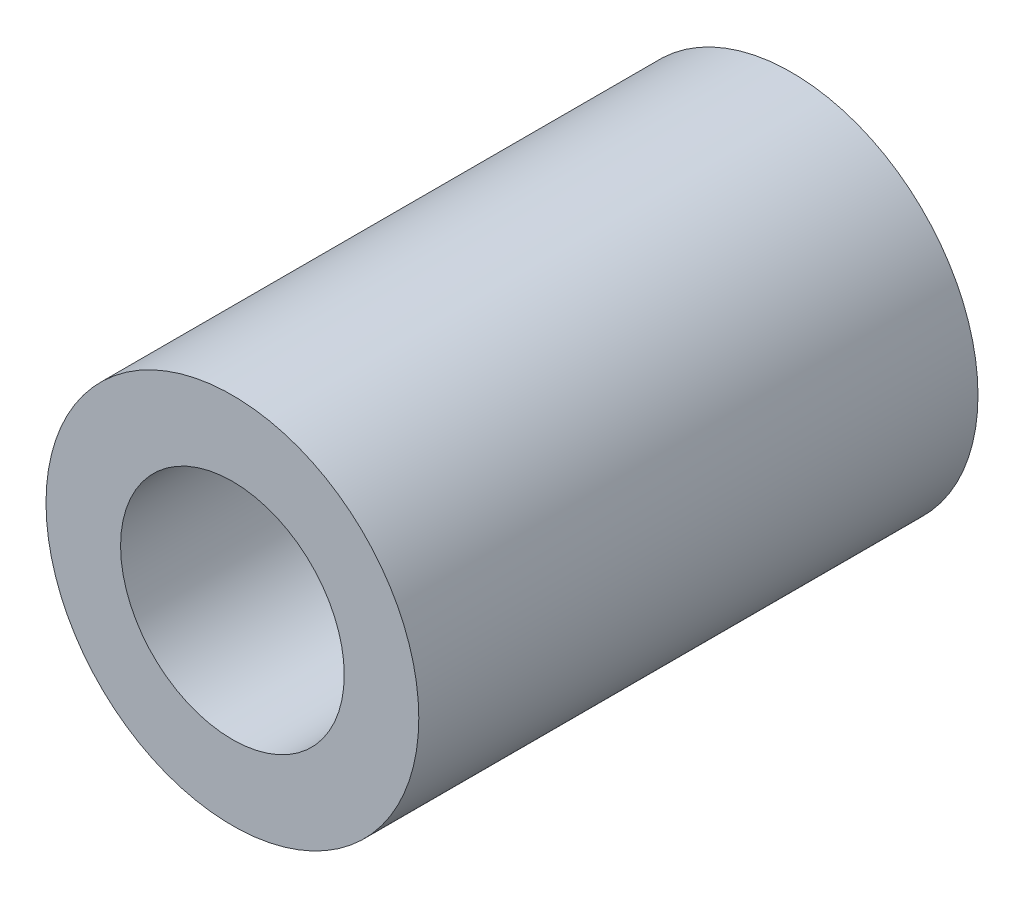
ISO-10303-21;
HEADER;
FILE_DESCRIPTION(('STEP AP214'),'2;1');
FILE_NAME('part.step','',(''),(''),'','','');
FILE_SCHEMA(('AUTOMOTIVE_DESIGN { 1 0 10303 214 1 1 1 1 }'));
ENDSEC;
DATA;
#1=APPLICATION_CONTEXT('core data for automotive mechanical design processes');
#2=APPLICATION_PROTOCOL_DEFINITION('international standard','automotive_design',2000,#1);
#3=PRODUCT_CONTEXT('',#1,'mechanical');
#4=PRODUCT('Part','Part','',(#3));
#5=PRODUCT_RELATED_PRODUCT_CATEGORY('part','',(#4));
#6=PRODUCT_DEFINITION_FORMATION('','',#4);
#7=PRODUCT_DEFINITION_CONTEXT('part definition',#1,'design');
#8=PRODUCT_DEFINITION('design','',#6,#7);
#9=PRODUCT_DEFINITION_SHAPE('','',#8);
#10=(LENGTH_UNIT() NAMED_UNIT(*) SI_UNIT(.MILLI.,.METRE.));
#11=(NAMED_UNIT(*) PLANE_ANGLE_UNIT() SI_UNIT($,.RADIAN.));
#12=(NAMED_UNIT(*) SI_UNIT($,.STERADIAN.) SOLID_ANGLE_UNIT());
#13=UNCERTAINTY_MEASURE_WITH_UNIT(LENGTH_MEASURE(1.E-05),#10,'distance_accuracy_value','');
#14=(GEOMETRIC_REPRESENTATION_CONTEXT(3) GLOBAL_UNCERTAINTY_ASSIGNED_CONTEXT((#13)) GLOBAL_UNIT_ASSIGNED_CONTEXT((#10,
#11,#12)) REPRESENTATION_CONTEXT('',''));
#15=CARTESIAN_POINT('',(0.,0.,0.));
#16=DIRECTION('',(0.,0.,1.));
#17=DIRECTION('',(1.,0.,0.));
#18=AXIS2_PLACEMENT_3D('',#15,#16,#17);
#19=CARTESIAN_POINT('',(0.,0.,15.));
#20=DIRECTION('',(0.,0.,1.));
#21=DIRECTION('',(1.,0.,0.));
#22=AXIS2_PLACEMENT_3D('',#19,#20,#21);
#23=PLANE('',#22);
#24=CARTESIAN_POINT('',(0.,0.,15.));
#25=DIRECTION('',(0.,0.,1.));
#26=DIRECTION('',(1.,0.,0.));
#27=AXIS2_PLACEMENT_3D('',#24,#25,#26);
#28=CIRCLE('',#27,10.);
#29=CARTESIAN_POINT('',(10.,0.,15.));
#30=VERTEX_POINT('',#29);
#31=EDGE_CURVE('E10',#30,#30,#28,.T.);
#32=ORIENTED_EDGE('',*,*,#31,.T.);
#33=EDGE_LOOP('',(#32));
#34=FACE_BOUND('',#33,.T.);
#35=CARTESIAN_POINT('',(0.,0.,15.));
#36=DIRECTION('',(0.,0.,1.));
#37=DIRECTION('',(1.,0.,0.));
#38=AXIS2_PLACEMENT_3D('',#35,#36,#37);
#39=CIRCLE('',#38,6.);
#40=CARTESIAN_POINT('',(6.,0.,15.));
#41=VERTEX_POINT('',#40);
#42=EDGE_CURVE('E48',#41,#41,#39,.T.);
#43=ORIENTED_EDGE('',*,*,#42,.F.);
#44=EDGE_LOOP('',(#43));
#45=FACE_BOUND('',#44,.T.);
#46=ADVANCED_FACE('F37',(#34,#45),#23,.T.);
#47=CARTESIAN_POINT('',(0.,0.,-15.));
#48=DIRECTION('',(0.,0.,1.));
#49=DIRECTION('',(1.,0.,0.));
#50=AXIS2_PLACEMENT_3D('',#47,#48,#49);
#51=PLANE('',#50);
#52=CARTESIAN_POINT('',(0.,0.,-15.));
#53=DIRECTION('',(0.,0.,1.));
#54=DIRECTION('',(1.,0.,0.));
#55=AXIS2_PLACEMENT_3D('',#52,#53,#54);
#56=CIRCLE('',#55,10.);
#57=CARTESIAN_POINT('',(10.,0.,-15.));
#58=VERTEX_POINT('',#57);
#59=EDGE_CURVE('E41',#58,#58,#56,.T.);
#60=ORIENTED_EDGE('',*,*,#59,.F.);
#61=EDGE_LOOP('',(#60));
#62=FACE_BOUND('',#61,.T.);
#63=CARTESIAN_POINT('',(0.,0.,-15.));
#64=DIRECTION('',(0.,0.,1.));
#65=DIRECTION('',(1.,0.,0.));
#66=AXIS2_PLACEMENT_3D('',#63,#64,#65);
#67=CIRCLE('',#66,6.);
#68=CARTESIAN_POINT('',(6.,0.,-15.));
#69=VERTEX_POINT('',#68);
#70=EDGE_CURVE('E50',#69,#69,#67,.T.);
#71=ORIENTED_EDGE('',*,*,#70,.T.);
#72=EDGE_LOOP('',(#71));
#73=FACE_BOUND('',#72,.T.);
#74=ADVANCED_FACE('F60',(#62,#73),#51,.F.);
#75=CARTESIAN_POINT('',(0.,0.,15.));
#76=DIRECTION('',(0.,0.,-1.));
#77=DIRECTION('',(-1.,0.,0.));
#78=AXIS2_PLACEMENT_3D('',#75,#76,#77);
#79=CYLINDRICAL_SURFACE('',#78,10.);
#80=ORIENTED_EDGE('',*,*,#31,.F.);
#81=EDGE_LOOP('',(#80));
#82=FACE_BOUND('',#81,.T.);
#83=ORIENTED_EDGE('',*,*,#59,.T.);
#84=EDGE_LOOP('',(#83));
#85=FACE_BOUND('',#84,.T.);
#86=ADVANCED_FACE('F39',(#82,#85),#79,.T.);
#87=CARTESIAN_POINT('',(0.,0.,15.));
#88=DIRECTION('',(0.,0.,-1.));
#89=DIRECTION('',(-1.,0.,0.));
#90=AXIS2_PLACEMENT_3D('',#87,#88,#89);
#91=CYLINDRICAL_SURFACE('',#90,6.);
#92=ORIENTED_EDGE('',*,*,#42,.T.);
#93=EDGE_LOOP('',(#92));
#94=FACE_BOUND('',#93,.T.);
#95=ORIENTED_EDGE('',*,*,#70,.F.);
#96=EDGE_LOOP('',(#95));
#97=FACE_BOUND('',#96,.T.);
#98=ADVANCED_FACE('F56',(#94,#97),#91,.F.);
#99=CLOSED_SHELL('',(#46,#74,#86,#98));
#100=MANIFOLD_SOLID_BREP('B2',#99);
#101=ADVANCED_BREP_SHAPE_REPRESENTATION('',(#18,#100),#14);
#102=SHAPE_DEFINITION_REPRESENTATION(#9,#101);
ENDSEC;
END-ISO-10303-21;
